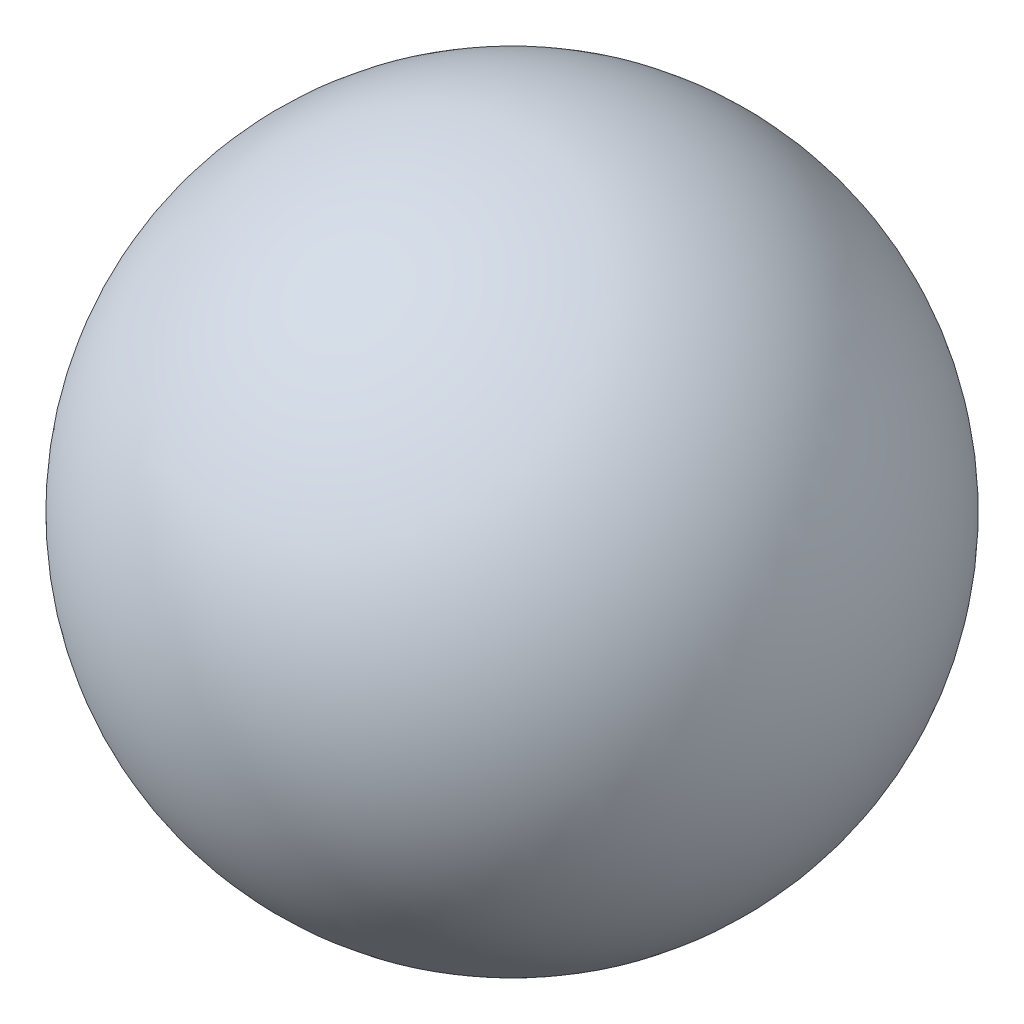
ISO-10303-21;
HEADER;
FILE_DESCRIPTION(('STEP AP214'),'2;1');
FILE_NAME('part.step','',(''),(''),'','','');
FILE_SCHEMA(('AUTOMOTIVE_DESIGN { 1 0 10303 214 1 1 1 1 }'));
ENDSEC;
DATA;
#1=APPLICATION_CONTEXT('core data for automotive mechanical design processes');
#2=APPLICATION_PROTOCOL_DEFINITION('international standard','automotive_design',2000,#1);
#3=PRODUCT_CONTEXT('',#1,'mechanical');
#4=PRODUCT('Part','Part','',(#3));
#5=PRODUCT_RELATED_PRODUCT_CATEGORY('part','',(#4));
#6=PRODUCT_DEFINITION_FORMATION('','',#4);
#7=PRODUCT_DEFINITION_CONTEXT('part definition',#1,'design');
#8=PRODUCT_DEFINITION('design','',#6,#7);
#9=PRODUCT_DEFINITION_SHAPE('','',#8);
#10=(LENGTH_UNIT() NAMED_UNIT(*) SI_UNIT(.MILLI.,.METRE.));
#11=(NAMED_UNIT(*) PLANE_ANGLE_UNIT() SI_UNIT($,.RADIAN.));
#12=(NAMED_UNIT(*) SI_UNIT($,.STERADIAN.) SOLID_ANGLE_UNIT());
#13=UNCERTAINTY_MEASURE_WITH_UNIT(LENGTH_MEASURE(1.E-05),#10,'distance_accuracy_value','');
#14=(GEOMETRIC_REPRESENTATION_CONTEXT(3) GLOBAL_UNCERTAINTY_ASSIGNED_CONTEXT((#13)) GLOBAL_UNIT_ASSIGNED_CONTEXT((#10,
#11,#12)) REPRESENTATION_CONTEXT('',''));
#15=CARTESIAN_POINT('',(0.,0.,0.));
#16=DIRECTION('',(0.,0.,1.));
#17=DIRECTION('',(1.,0.,0.));
#18=AXIS2_PLACEMENT_3D('',#15,#16,#17);
#19=CARTESIAN_POINT('',(0.,0.,0.));
#20=DIRECTION('',(0.,1.,0.));
#21=DIRECTION('',(-1.,0.,0.));
#22=AXIS2_PLACEMENT_3D('',#19,#20,#21);
#23=SPHERICAL_SURFACE('',#22,8.);
#24=CARTESIAN_POINT('',(0.,8.,0.));
#25=VERTEX_POINT('',#24);
#26=VERTEX_LOOP('',#25);
#27=FACE_BOUND('',#26,.T.);
#28=ADVANCED_FACE('F37',(#27),#23,.T.);
#29=CLOSED_SHELL('',(#28));
#30=CARTESIAN_POINT('',(0.,0.,0.));
#31=DIRECTION('',(0.,1.,0.));
#32=DIRECTION('',(1.,0.,0.));
#33=AXIS2_PLACEMENT_3D('',#30,#31,#32);
#34=SPHERICAL_SURFACE('',#33,7.);
#35=CARTESIAN_POINT('',(0.,7.,0.));
#36=VERTEX_POINT('',#35);
#37=VERTEX_LOOP('',#36);
#38=FACE_BOUND('',#37,.T.);
#39=ADVANCED_FACE('F50',(#38),#34,.F.);
#40=CLOSED_SHELL('',(#39));
#41=ORIENTED_CLOSED_SHELL('',*,#40,.T.);
#42=BREP_WITH_VOIDS('B2',#29,(#41));
#43=CARTESIAN_POINT('',(0.,0.,0.));
#44=DIRECTION('',(0.,1.,0.));
#45=DIRECTION('',(1.,0.,0.));
#46=AXIS2_PLACEMENT_3D('',#43,#44,#45);
#47=SPHERICAL_SURFACE('',#46,7.);
#48=CARTESIAN_POINT('',(0.,7.,0.));
#49=VERTEX_POINT('',#48);
#50=VERTEX_LOOP('',#49);
#51=FACE_BOUND('',#50,.T.);
#52=ADVANCED_FACE('F60',(#51),#47,.T.);
#53=CLOSED_SHELL('',(#52));
#54=MANIFOLD_SOLID_BREP('B6',#53);
#55=ADVANCED_BREP_SHAPE_REPRESENTATION('',(#18,#42,#54),#14);
#56=SHAPE_DEFINITION_REPRESENTATION(#9,#55);
ENDSEC;
END-ISO-10303-21;
